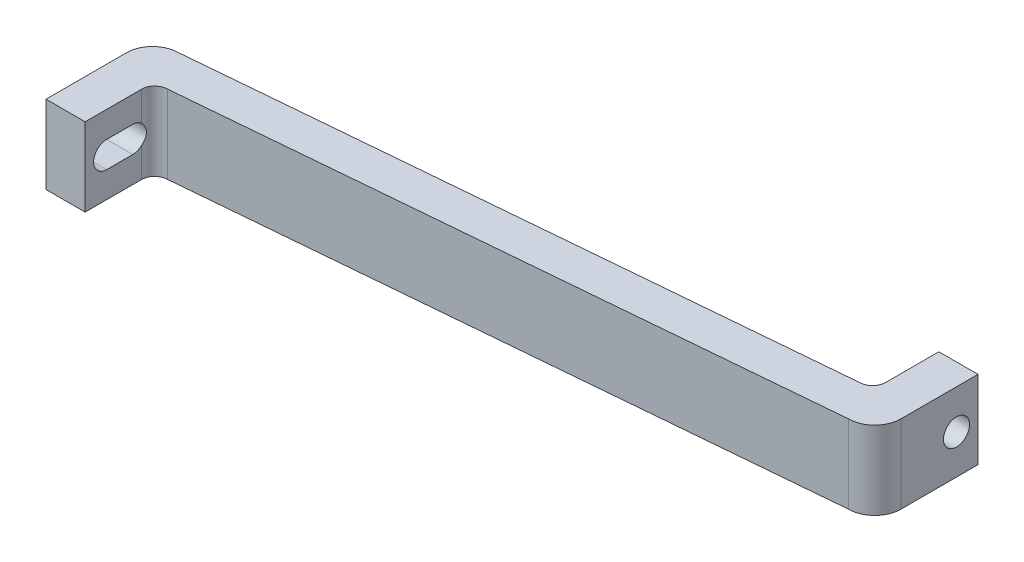
ISO-10303-21;
HEADER;
FILE_DESCRIPTION(('STEP AP214'),'2;1');
FILE_NAME('part.step','',(''),(''),'','','');
FILE_SCHEMA(('AUTOMOTIVE_DESIGN { 1 0 10303 214 1 1 1 1 }'));
ENDSEC;
DATA;
#1=APPLICATION_CONTEXT('core data for automotive mechanical design processes');
#2=APPLICATION_PROTOCOL_DEFINITION('international standard','automotive_design',2000,#1);
#3=PRODUCT_CONTEXT('',#1,'mechanical');
#4=PRODUCT('Part','Part','',(#3));
#5=PRODUCT_RELATED_PRODUCT_CATEGORY('part','',(#4));
#6=PRODUCT_DEFINITION_FORMATION('','',#4);
#7=PRODUCT_DEFINITION_CONTEXT('part definition',#1,'design');
#8=PRODUCT_DEFINITION('design','',#6,#7);
#9=PRODUCT_DEFINITION_SHAPE('','',#8);
#10=(LENGTH_UNIT() NAMED_UNIT(*) SI_UNIT(.MILLI.,.METRE.));
#11=(NAMED_UNIT(*) PLANE_ANGLE_UNIT() SI_UNIT($,.RADIAN.));
#12=(NAMED_UNIT(*) SI_UNIT($,.STERADIAN.) SOLID_ANGLE_UNIT());
#13=UNCERTAINTY_MEASURE_WITH_UNIT(LENGTH_MEASURE(1.E-05),#10,'distance_accuracy_value','');
#14=(GEOMETRIC_REPRESENTATION_CONTEXT(3) GLOBAL_UNCERTAINTY_ASSIGNED_CONTEXT((#13)) GLOBAL_UNIT_ASSIGNED_CONTEXT((#10,
#11,#12)) REPRESENTATION_CONTEXT('',''));
#15=CARTESIAN_POINT('',(0.,0.,0.));
#16=DIRECTION('',(0.,0.,1.));
#17=DIRECTION('',(1.,0.,0.));
#18=AXIS2_PLACEMENT_3D('',#15,#16,#17);
#19=CARTESIAN_POINT('',(0.,6.,0.));
#20=DIRECTION('',(1.,0.,0.));
#21=DIRECTION('',(0.,0.,-1.));
#22=AXIS2_PLACEMENT_3D('',#19,#20,#21);
#23=PLANE('',#22);
#24=DIRECTION('',(0.,0.,1.));
#25=VECTOR('',#24,1.);
#26=CARTESIAN_POINT('',(0.,0.,0.));
#27=LINE('',#26,#25);
#28=CARTESIAN_POINT('',(0.,0.,-6.17));
#29=VERTEX_POINT('',#28);
#30=CARTESIAN_POINT('',(0.,0.,0.));
#31=VERTEX_POINT('',#30);
#32=EDGE_CURVE('E272',#29,#31,#27,.T.);
#33=ORIENTED_EDGE('',*,*,#32,.T.);
#34=DIRECTION('',(0.,-1.,0.));
#35=VECTOR('',#34,1.);
#36=CARTESIAN_POINT('',(0.,6.,0.));
#37=LINE('',#36,#35);
#38=CARTESIAN_POINT('',(0.,6.,0.));
#39=VERTEX_POINT('',#38);
#40=EDGE_CURVE('E296',#39,#31,#37,.T.);
#41=ORIENTED_EDGE('',*,*,#40,.F.);
#42=DIRECTION('',(0.,0.,1.));
#43=VECTOR('',#42,1.);
#44=CARTESIAN_POINT('',(0.,6.,0.));
#45=LINE('',#44,#43);
#46=CARTESIAN_POINT('',(0.,6.,-6.17));
#47=VERTEX_POINT('',#46);
#48=EDGE_CURVE('E231',#47,#39,#45,.T.);
#49=ORIENTED_EDGE('',*,*,#48,.F.);
#50=DIRECTION('',(0.,-1.,0.));
#51=VECTOR('',#50,1.);
#52=CARTESIAN_POINT('',(0.,6.,-6.17));
#53=LINE('',#52,#51);
#54=EDGE_CURVE('E300',#47,#29,#53,.T.);
#55=ORIENTED_EDGE('',*,*,#54,.T.);
#56=EDGE_LOOP('',(#33,#41,#49,#55));
#57=FACE_BOUND('',#56,.T.);
#58=CARTESIAN_POINT('',(0.,3.,-1.65));
#59=DIRECTION('',(1.,0.,0.));
#60=DIRECTION('',(0.,0.,-1.));
#61=AXIS2_PLACEMENT_3D('',#58,#59,#60);
#62=CIRCLE('',#61,1.);
#63=CARTESIAN_POINT('',(0.,4.,-1.65));
#64=VERTEX_POINT('',#63);
#65=CARTESIAN_POINT('',(0.,2.,-1.65));
#66=VERTEX_POINT('',#65);
#67=EDGE_CURVE('E62',#64,#66,#62,.T.);
#68=ORIENTED_EDGE('',*,*,#67,.T.);
#69=DIRECTION('',(0.,0.,-1.));
#70=VECTOR('',#69,1.);
#71=CARTESIAN_POINT('',(0.,2.,-1.65));
#72=LINE('',#71,#70);
#73=CARTESIAN_POINT('',(0.,2.,-3.65));
#74=VERTEX_POINT('',#73);
#75=EDGE_CURVE('E187',#66,#74,#72,.T.);
#76=ORIENTED_EDGE('',*,*,#75,.T.);
#77=CARTESIAN_POINT('',(0.,3.,-3.65));
#78=DIRECTION('',(1.,0.,0.));
#79=DIRECTION('',(0.,0.,-1.));
#80=AXIS2_PLACEMENT_3D('',#77,#78,#79);
#81=CIRCLE('',#80,1.);
#82=CARTESIAN_POINT('',(0.,4.,-3.65));
#83=VERTEX_POINT('',#82);
#84=EDGE_CURVE('E170',#74,#83,#81,.T.);
#85=ORIENTED_EDGE('',*,*,#84,.T.);
#86=DIRECTION('',(0.,0.,1.));
#87=VECTOR('',#86,1.);
#88=CARTESIAN_POINT('',(0.,4.,-1.65));
#89=LINE('',#88,#87);
#90=EDGE_CURVE('E181',#83,#64,#89,.T.);
#91=ORIENTED_EDGE('',*,*,#90,.T.);
#92=EDGE_LOOP('',(#68,#76,#85,#91));
#93=FACE_BOUND('',#92,.T.);
#94=ADVANCED_FACE('F45',(#57,#93),#23,.F.);
#95=CARTESIAN_POINT('',(3.,6.,0.));
#96=DIRECTION('',(-1.,0.,0.));
#97=DIRECTION('',(0.,0.,1.));
#98=AXIS2_PLACEMENT_3D('',#95,#96,#97);
#99=PLANE('',#98);
#100=CARTESIAN_POINT('',(3.,3.,-3.65));
#101=DIRECTION('',(-1.,0.,0.));
#102=DIRECTION('',(0.,0.,1.));
#103=AXIS2_PLACEMENT_3D('',#100,#101,#102);
#104=CIRCLE('',#103,1.);
#105=CARTESIAN_POINT('',(3.,2.,-3.65));
#106=VERTEX_POINT('',#105);
#107=CARTESIAN_POINT('',(3.,2.26678788880707,-4.33));
#108=VERTEX_POINT('',#107);
#109=EDGE_CURVE('E70',#106,#108,#104,.F.);
#110=ORIENTED_EDGE('',*,*,#109,.F.);
#111=DIRECTION('',(0.,0.,-1.));
#112=VECTOR('',#111,1.);
#113=CARTESIAN_POINT('',(3.,2.,0.));
#114=LINE('',#113,#112);
#115=CARTESIAN_POINT('',(3.,2.,-1.65));
#116=VERTEX_POINT('',#115);
#117=EDGE_CURVE('E11',#116,#106,#114,.T.);
#118=ORIENTED_EDGE('',*,*,#117,.F.);
#119=CARTESIAN_POINT('',(3.,3.,-1.65));
#120=DIRECTION('',(-1.,0.,0.));
#121=DIRECTION('',(0.,0.,1.));
#122=AXIS2_PLACEMENT_3D('',#119,#120,#121);
#123=CIRCLE('',#122,1.);
#124=CARTESIAN_POINT('',(3.,4.,-1.65));
#125=VERTEX_POINT('',#124);
#126=EDGE_CURVE('E55',#125,#116,#123,.F.);
#127=ORIENTED_EDGE('',*,*,#126,.F.);
#128=DIRECTION('',(0.,0.,1.));
#129=VECTOR('',#128,1.);
#130=CARTESIAN_POINT('',(3.,4.,0.));
#131=LINE('',#130,#129);
#132=CARTESIAN_POINT('',(3.,4.,-3.65));
#133=VERTEX_POINT('',#132);
#134=EDGE_CURVE('E338',#133,#125,#131,.T.);
#135=ORIENTED_EDGE('',*,*,#134,.F.);
#136=CARTESIAN_POINT('',(3.,3.73321211119294,-4.33));
#137=VERTEX_POINT('',#136);
#138=EDGE_CURVE('E173',#137,#133,#104,.F.);
#139=ORIENTED_EDGE('',*,*,#138,.F.);
#140=DIRECTION('',(0.,-1.,0.));
#141=VECTOR('',#140,1.);
#142=CARTESIAN_POINT('',(3.,6.,-4.33));
#143=LINE('',#142,#141);
#144=CARTESIAN_POINT('',(3.,6.,-4.33));
#145=VERTEX_POINT('',#144);
#146=EDGE_CURVE('E288',#145,#137,#143,.T.);
#147=ORIENTED_EDGE('',*,*,#146,.F.);
#148=DIRECTION('',(0.,0.,-1.));
#149=VECTOR('',#148,1.);
#150=CARTESIAN_POINT('',(3.,6.,0.));
#151=LINE('',#150,#149);
#152=CARTESIAN_POINT('',(3.,6.,0.));
#153=VERTEX_POINT('',#152);
#154=EDGE_CURVE('E237',#153,#145,#151,.T.);
#155=ORIENTED_EDGE('',*,*,#154,.F.);
#156=DIRECTION('',(0.,-1.,0.));
#157=VECTOR('',#156,1.);
#158=CARTESIAN_POINT('',(3.,6.,0.));
#159=LINE('',#158,#157);
#160=CARTESIAN_POINT('',(3.,0.,0.));
#161=VERTEX_POINT('',#160);
#162=EDGE_CURVE('E292',#153,#161,#159,.T.);
#163=ORIENTED_EDGE('',*,*,#162,.T.);
#164=DIRECTION('',(0.,0.,-1.));
#165=VECTOR('',#164,1.);
#166=CARTESIAN_POINT('',(3.,0.,0.));
#167=LINE('',#166,#165);
#168=CARTESIAN_POINT('',(3.,0.,-4.33));
#169=VERTEX_POINT('',#168);
#170=EDGE_CURVE('E278',#161,#169,#167,.T.);
#171=ORIENTED_EDGE('',*,*,#170,.T.);
#172=EDGE_CURVE('E287',#108,#169,#143,.T.);
#173=ORIENTED_EDGE('',*,*,#172,.F.);
#174=EDGE_LOOP('',(#110,#118,#127,#135,#139,#147,#155,#163,#171,#173));
#175=FACE_BOUND('',#174,.T.);
#176=ADVANCED_FACE('F366',(#175),#99,.F.);
#177=CARTESIAN_POINT('',(4.,6.,-4.33));
#178=DIRECTION('',(0.,-1.,0.));
#179=DIRECTION('',(0.,0.,-1.));
#180=AXIS2_PLACEMENT_3D('',#177,#178,#179);
#181=CYLINDRICAL_SURFACE('',#180,1.);
#182=ORIENTED_EDGE('',*,*,#146,.T.);
#183=CARTESIAN_POINT('',(3.26678788880707,4.,-3.65));
#184=CARTESIAN_POINT('',(3.25178376454856,3.9999995600018,-3.66617737828708));
#185=CARTESIAN_POINT('',(3.2373201952967,3.99960684613958,-3.68284872467413));
#186=CARTESIAN_POINT('',(3.20953873963745,3.99789462524912,-3.71709062883816));
#187=CARTESIAN_POINT('',(3.19622155448264,3.99657455540875,-3.73466172666719));
#188=CARTESIAN_POINT('',(3.15811078578757,3.99100994952407,-3.78856402844171));
#189=CARTESIAN_POINT('',(3.13516062083566,3.98516096779698,-3.82608139622115));
#190=CARTESIAN_POINT('',(3.09467911692455,3.9682600804344,-3.9030412269704));
#191=CARTESIAN_POINT('',(3.07717090781149,3.95718645698041,-3.94249110375919));
#192=CARTESIAN_POINT('',(3.04786400906989,3.92939505847322,-4.02144428422188));
#193=CARTESIAN_POINT('',(3.03605526630723,3.91268731041056,-4.06094736966464));
#194=CARTESIAN_POINT('',(3.01819719280977,3.87471772816809,-4.13637529458406));
#195=CARTESIAN_POINT('',(3.01188213251226,3.85373535001076,-4.17237959382102));
#196=CARTESIAN_POINT('',(3.00328023765935,3.80715814302278,-4.241816443539));
#197=CARTESIAN_POINT('',(3.00099757762566,3.78155856442955,-4.27524629464528));
#198=CARTESIAN_POINT('',(2.99948319855647,3.72440002016129,-4.34084542047995));
#199=CARTESIAN_POINT('',(3.00047497620464,3.69255022303543,-4.37276485516487));
#200=CARTESIAN_POINT('',(3.00476825684486,3.6249479609544,-4.43196054765461));
#201=CARTESIAN_POINT('',(3.0080707109313,3.5891938940841,-4.45923488774832));
#202=CARTESIAN_POINT('',(3.01640923956586,3.50830458847194,-4.51275511640822));
#203=CARTESIAN_POINT('',(3.02164066512675,3.46259197634722,-4.53810091068781));
#204=CARTESIAN_POINT('',(3.03185745331535,3.36774448977744,-4.58138840093687));
#205=CARTESIAN_POINT('',(3.03684270165387,3.31860805085512,-4.59932668585707));
#206=CARTESIAN_POINT('',(3.04545351312479,3.21388146799959,-4.62848873279843));
#207=CARTESIAN_POINT('',(3.04893557957648,3.15809141683282,-4.63904802283926));
#208=CARTESIAN_POINT('',(3.05275394938631,3.04543959150949,-4.650568807351));
#209=CARTESIAN_POINT('',(3.0530918650563,2.98857838163205,-4.65153522103946));
#210=CARTESIAN_POINT('',(3.05058152477468,2.87831115260463,-4.64403205264557));
#211=CARTESIAN_POINT('',(3.04788513752207,2.82487010942416,-4.63601231561025));
#212=CARTESIAN_POINT('',(3.04036540449292,2.72009989305686,-4.61153683753795));
#213=CARTESIAN_POINT('',(3.03554093566076,2.66877185062521,-4.59507664145887));
#214=CARTESIAN_POINT('',(3.02512714399403,2.56854295160656,-4.55379121548656));
#215=CARTESIAN_POINT('',(3.01952512804795,2.51970600960119,-4.52881428812914));
#216=CARTESIAN_POINT('',(3.00957732660491,2.4266404940192,-4.47113109605599));
#217=CARTESIAN_POINT('',(3.00523209956153,2.38241397464729,-4.43842140698719));
#218=CARTESIAN_POINT('',(2.99993152630887,2.29883286109319,-4.36520471212874));
#219=CARTESIAN_POINT('',(2.99905575481038,2.25961238860003,-4.3245368845681));
#220=CARTESIAN_POINT('',(3.00335143385569,2.18874307393746,-4.23736615906667));
#221=CARTESIAN_POINT('',(3.00851061802957,2.15707903019611,-4.19087526806731));
#222=CARTESIAN_POINT('',(3.0255693822638,2.10642565266758,-4.10141796296781));
#223=CARTESIAN_POINT('',(3.03639108260889,2.08626762447306,-4.05890839736898));
#224=CARTESIAN_POINT('',(3.06465081725159,2.05263609564171,-3.97343075779005));
#225=CARTESIAN_POINT('',(3.08208769119422,2.03916142364601,-3.9304627655056));
#226=CARTESIAN_POINT('',(3.12099467571556,2.01974865214346,-3.85140413185106));
#227=CARTESIAN_POINT('',(3.14171524450544,2.01309269678036,-3.81511310208953));
#228=CARTESIAN_POINT('',(3.18780320391956,2.00390964159642,-3.74511810545286));
#229=CARTESIAN_POINT('',(3.21316454291202,2.00137720672712,-3.71141084959077));
#230=CARTESIAN_POINT('',(3.24909767380794,2.00013866123841,-3.66945366386968));
#231=CARTESIAN_POINT('',(3.25784911545044,1.99999890727192,-3.65963477501586));
#232=CARTESIAN_POINT('',(3.26678788880707,2.,-3.65));
#233=B_SPLINE_CURVE_WITH_KNOTS('',3,(#183,#184,#185,#186,#187,#188,#189,#190,#191,#192,#193,
#194,#195,#196,#197,#198,#199,#200,#201,#202,#203,#204,#205,#206,#207,#208,#209,#210,#211,#212,
#213,#214,#215,#216,#217,#218,#219,#220,#221,#222,#223,#224,#225,#226,#227,#228,#229,#230,#231,
#232),.UNSPECIFIED.,.F.,.F.,(4,2,2,2,2,2,2,2,2,2,2,2,2,2,2,2,2,2,2,2,2,2,2,2,4),(0.,
0.0661634046356082,0.132366998555311,0.264785679311134,0.397759714689861,0.530498335730469,
0.656388071064974,0.782408056895384,0.917202535916838,1.05205253017516,1.20898894194653,
1.36599754025999,1.53577117833319,1.70545775215156,1.86701491890665,2.0286574466554,
2.19334412376059,2.35810386728662,2.52662135463651,2.69479691549295,2.83874943332919,
2.98267671239465,3.10908036966758,3.23532035441075,3.27476426188391),.UNSPECIFIED.);
#234=EDGE_CURVE('E329',#137,#108,#233,.T.);
#235=ORIENTED_EDGE('',*,*,#234,.T.);
#236=ORIENTED_EDGE('',*,*,#172,.T.);
#237=CARTESIAN_POINT('',(4.,0.,-4.33));
#238=DIRECTION('',(0.,1.,0.));
#239=DIRECTION('',(0.,0.,1.));
#240=AXIS2_PLACEMENT_3D('',#237,#238,#239);
#241=CIRCLE('',#240,1.);
#242=CARTESIAN_POINT('',(4.,0.,-5.33));
#243=VERTEX_POINT('',#242);
#244=EDGE_CURVE('E208',#243,#169,#241,.T.);
#245=ORIENTED_EDGE('',*,*,#244,.F.);
#246=DIRECTION('',(0.,-1.,0.));
#247=VECTOR('',#246,1.);
#248=CARTESIAN_POINT('',(4.,6.,-5.33));
#249=LINE('',#248,#247);
#250=CARTESIAN_POINT('',(4.,6.,-5.33));
#251=VERTEX_POINT('',#250);
#252=EDGE_CURVE('E244',#251,#243,#249,.T.);
#253=ORIENTED_EDGE('',*,*,#252,.F.);
#254=CARTESIAN_POINT('',(4.,6.,-4.33));
#255=DIRECTION('',(0.,1.,0.));
#256=DIRECTION('',(0.,0.,1.));
#257=AXIS2_PLACEMENT_3D('',#254,#255,#256);
#258=CIRCLE('',#257,1.);
#259=EDGE_CURVE('E240',#251,#145,#258,.T.);
#260=ORIENTED_EDGE('',*,*,#259,.T.);
#261=EDGE_LOOP('',(#182,#235,#236,#245,#253,#260));
#262=FACE_BOUND('',#261,.T.);
#263=ADVANCED_FACE('F340',(#262),#181,.F.);
#264=CARTESIAN_POINT('',(-0.433380520967159,6.,-4.9411555834735));
#265=DIRECTION('',(-0.0873729081377682,0.,-0.996175674729889));
#266=DIRECTION('',(-0.996175674729889,0.,0.0873729081377682));
#267=AXIS2_PLACEMENT_3D('',#264,#265,#266);
#268=PLANE('',#267);
#269=DIRECTION('',(0.996175674729889,0.,-0.0873729081377682));
#270=VECTOR('',#269,1.);
#271=CARTESIAN_POINT('',(-0.433380520967159,0.,-4.9411555834735));
#272=LINE('',#271,#270);
#273=CARTESIAN_POINT('',(52.,0.,-9.54000000000004));
#274=VERTEX_POINT('',#273);
#275=EDGE_CURVE('E202',#243,#274,#272,.T.);
#276=ORIENTED_EDGE('',*,*,#275,.T.);
#277=DIRECTION('',(0.,-1.,0.));
#278=VECTOR('',#277,1.);
#279=CARTESIAN_POINT('',(52.,6.,-9.54000000000004));
#280=LINE('',#279,#278);
#281=CARTESIAN_POINT('',(52.,6.,-9.54000000000004));
#282=VERTEX_POINT('',#281);
#283=EDGE_CURVE('E325',#282,#274,#280,.T.);
#284=ORIENTED_EDGE('',*,*,#283,.F.);
#285=DIRECTION('',(0.996175674729889,0.,-0.0873729081377682));
#286=VECTOR('',#285,1.);
#287=CARTESIAN_POINT('',(-0.433380520967159,6.,-4.9411555834735));
#288=LINE('',#287,#286);
#289=EDGE_CURVE('E203',#251,#282,#288,.T.);
#290=ORIENTED_EDGE('',*,*,#289,.F.);
#291=ORIENTED_EDGE('',*,*,#252,.T.);
#292=EDGE_LOOP('',(#276,#284,#290,#291));
#293=FACE_BOUND('',#292,.T.);
#294=ADVANCED_FACE('F47',(#293),#268,.F.);
#295=CARTESIAN_POINT('',(52.,6.,-11.54));
#296=DIRECTION('',(0.,-1.,0.));
#297=DIRECTION('',(0.,0.,-1.));
#298=AXIS2_PLACEMENT_3D('',#295,#296,#297);
#299=CYLINDRICAL_SURFACE('',#298,2.);
#300=CARTESIAN_POINT('',(52.,0.,-11.54));
#301=DIRECTION('',(0.,1.,0.));
#302=DIRECTION('',(0.,0.,1.));
#303=AXIS2_PLACEMENT_3D('',#300,#301,#302);
#304=CIRCLE('',#303,2.);
#305=CARTESIAN_POINT('',(54.,0.,-11.54));
#306=VERTEX_POINT('',#305);
#307=EDGE_CURVE('E248',#274,#306,#304,.T.);
#308=ORIENTED_EDGE('',*,*,#307,.T.);
#309=DIRECTION('',(0.,-1.,0.));
#310=VECTOR('',#309,1.);
#311=CARTESIAN_POINT('',(54.,6.,-11.54));
#312=LINE('',#311,#310);
#313=CARTESIAN_POINT('',(54.,6.,-11.54));
#314=VERTEX_POINT('',#313);
#315=EDGE_CURVE('E321',#314,#306,#312,.T.);
#316=ORIENTED_EDGE('',*,*,#315,.F.);
#317=CARTESIAN_POINT('',(52.,6.,-11.54));
#318=DIRECTION('',(0.,1.,0.));
#319=DIRECTION('',(0.,0.,1.));
#320=AXIS2_PLACEMENT_3D('',#317,#318,#319);
#321=CIRCLE('',#320,2.);
#322=EDGE_CURVE('E207',#282,#314,#321,.T.);
#323=ORIENTED_EDGE('',*,*,#322,.F.);
#324=ORIENTED_EDGE('',*,*,#283,.T.);
#325=EDGE_LOOP('',(#308,#316,#323,#324));
#326=FACE_BOUND('',#325,.T.);
#327=ADVANCED_FACE('F397',(#326),#299,.T.);
#328=CARTESIAN_POINT('',(54.,6.,0.));
#329=DIRECTION('',(-1.,0.,0.));
#330=DIRECTION('',(0.,0.,1.));
#331=AXIS2_PLACEMENT_3D('',#328,#329,#330);
#332=PLANE('',#331);
#333=CARTESIAN_POINT('',(54.,3.00000000000001,-15.81));
#334=DIRECTION('',(-1.,0.,0.));
#335=DIRECTION('',(0.,0.,1.));
#336=AXIS2_PLACEMENT_3D('',#333,#334,#335);
#337=CIRCLE('',#336,1.00000000000001);
#338=CARTESIAN_POINT('',(54.,3.00000000000001,-14.81));
#339=VERTEX_POINT('',#338);
#340=EDGE_CURVE('E198',#339,#339,#337,.F.);
#341=ORIENTED_EDGE('',*,*,#340,.F.);
#342=EDGE_LOOP('',(#341));
#343=FACE_BOUND('',#342,.T.);
#344=DIRECTION('',(0.,0.,-1.));
#345=VECTOR('',#344,1.);
#346=CARTESIAN_POINT('',(54.,0.,0.));
#347=LINE('',#346,#345);
#348=CARTESIAN_POINT('',(54.,0.,-17.46));
#349=VERTEX_POINT('',#348);
#350=EDGE_CURVE('E251',#306,#349,#347,.T.);
#351=ORIENTED_EDGE('',*,*,#350,.T.);
#352=DIRECTION('',(0.,-1.,0.));
#353=VECTOR('',#352,1.);
#354=CARTESIAN_POINT('',(54.,6.,-17.46));
#355=LINE('',#354,#353);
#356=CARTESIAN_POINT('',(54.,6.,-17.46));
#357=VERTEX_POINT('',#356);
#358=EDGE_CURVE('E317',#357,#349,#355,.T.);
#359=ORIENTED_EDGE('',*,*,#358,.F.);
#360=DIRECTION('',(0.,0.,-1.));
#361=VECTOR('',#360,1.);
#362=CARTESIAN_POINT('',(54.,6.,0.));
#363=LINE('',#362,#361);
#364=EDGE_CURVE('E211',#314,#357,#363,.T.);
#365=ORIENTED_EDGE('',*,*,#364,.F.);
#366=ORIENTED_EDGE('',*,*,#315,.T.);
#367=EDGE_LOOP('',(#351,#359,#365,#366));
#368=FACE_BOUND('',#367,.T.);
#369=ADVANCED_FACE('F394',(#343,#368),#332,.F.);
#370=CARTESIAN_POINT('',(0.,6.,-17.46));
#371=DIRECTION('',(0.,0.,1.));
#372=DIRECTION('',(1.,0.,0.));
#373=AXIS2_PLACEMENT_3D('',#370,#371,#372);
#374=PLANE('',#373);
#375=DIRECTION('',(-1.,0.,0.));
#376=VECTOR('',#375,1.);
#377=CARTESIAN_POINT('',(0.,0.,-17.46));
#378=LINE('',#377,#376);
#379=CARTESIAN_POINT('',(51.,0.,-17.46));
#380=VERTEX_POINT('',#379);
#381=EDGE_CURVE('E254',#349,#380,#378,.T.);
#382=ORIENTED_EDGE('',*,*,#381,.T.);
#383=DIRECTION('',(0.,-1.,0.));
#384=VECTOR('',#383,1.);
#385=CARTESIAN_POINT('',(51.,6.,-17.46));
#386=LINE('',#385,#384);
#387=CARTESIAN_POINT('',(51.,6.,-17.46));
#388=VERTEX_POINT('',#387);
#389=EDGE_CURVE('E313',#388,#380,#386,.T.);
#390=ORIENTED_EDGE('',*,*,#389,.F.);
#391=DIRECTION('',(-1.,0.,0.));
#392=VECTOR('',#391,1.);
#393=CARTESIAN_POINT('',(0.,6.,-17.46));
#394=LINE('',#393,#392);
#395=EDGE_CURVE('E214',#357,#388,#394,.T.);
#396=ORIENTED_EDGE('',*,*,#395,.F.);
#397=ORIENTED_EDGE('',*,*,#358,.T.);
#398=EDGE_LOOP('',(#382,#390,#396,#397));
#399=FACE_BOUND('',#398,.T.);
#400=ADVANCED_FACE('F390',(#399),#374,.F.);
#401=CARTESIAN_POINT('',(51.,6.,0.));
#402=DIRECTION('',(1.,0.,0.));
#403=DIRECTION('',(0.,0.,-1.));
#404=AXIS2_PLACEMENT_3D('',#401,#402,#403);
#405=PLANE('',#404);
#406=CARTESIAN_POINT('',(51.,3.00000000000001,-15.81));
#407=DIRECTION('',(1.,0.,0.));
#408=DIRECTION('',(0.,0.,-1.));
#409=AXIS2_PLACEMENT_3D('',#406,#407,#408);
#410=CIRCLE('',#409,1.00000000000001);
#411=CARTESIAN_POINT('',(51.,3.00000000000001,-16.81));
#412=VERTEX_POINT('',#411);
#413=EDGE_CURVE('E49',#412,#412,#410,.F.);
#414=ORIENTED_EDGE('',*,*,#413,.F.);
#415=EDGE_LOOP('',(#414));
#416=FACE_BOUND('',#415,.T.);
#417=DIRECTION('',(0.,0.,1.));
#418=VECTOR('',#417,1.);
#419=CARTESIAN_POINT('',(51.,0.,0.));
#420=LINE('',#419,#418);
#421=CARTESIAN_POINT('',(51.,0.,-13.38));
#422=VERTEX_POINT('',#421);
#423=EDGE_CURVE('E257',#380,#422,#420,.T.);
#424=ORIENTED_EDGE('',*,*,#423,.T.);
#425=DIRECTION('',(0.,-1.,0.));
#426=VECTOR('',#425,1.);
#427=CARTESIAN_POINT('',(51.,6.,-13.38));
#428=LINE('',#427,#426);
#429=CARTESIAN_POINT('',(51.,6.,-13.38));
#430=VERTEX_POINT('',#429);
#431=EDGE_CURVE('E310',#430,#422,#428,.T.);
#432=ORIENTED_EDGE('',*,*,#431,.F.);
#433=DIRECTION('',(0.,0.,1.));
#434=VECTOR('',#433,1.);
#435=CARTESIAN_POINT('',(51.,6.,0.));
#436=LINE('',#435,#434);
#437=EDGE_CURVE('E217',#388,#430,#436,.T.);
#438=ORIENTED_EDGE('',*,*,#437,.F.);
#439=ORIENTED_EDGE('',*,*,#389,.T.);
#440=EDGE_LOOP('',(#424,#432,#438,#439));
#441=FACE_BOUND('',#440,.T.);
#442=ADVANCED_FACE('F386',(#416,#441),#405,.F.);
#443=CARTESIAN_POINT('',(50.,6.,-13.38));
#444=DIRECTION('',(0.,-1.,0.));
#445=DIRECTION('',(0.,0.,-1.));
#446=AXIS2_PLACEMENT_3D('',#443,#444,#445);
#447=CYLINDRICAL_SURFACE('',#446,0.999999999999999);
#448=CARTESIAN_POINT('',(50.,0.,-13.38));
#449=DIRECTION('',(0.,1.,0.));
#450=DIRECTION('',(0.,0.,1.));
#451=AXIS2_PLACEMENT_3D('',#448,#449,#450);
#452=CIRCLE('',#451,0.999999999999999);
#453=CARTESIAN_POINT('',(50.,0.,-12.38));
#454=VERTEX_POINT('',#453);
#455=EDGE_CURVE('E261',#454,#422,#452,.T.);
#456=ORIENTED_EDGE('',*,*,#455,.F.);
#457=DIRECTION('',(0.,-1.,0.));
#458=VECTOR('',#457,1.);
#459=CARTESIAN_POINT('',(50.,6.,-12.38));
#460=LINE('',#459,#458);
#461=CARTESIAN_POINT('',(50.,6.,-12.38));
#462=VERTEX_POINT('',#461);
#463=EDGE_CURVE('E307',#462,#454,#460,.T.);
#464=ORIENTED_EDGE('',*,*,#463,.F.);
#465=CARTESIAN_POINT('',(50.,6.,-13.38));
#466=DIRECTION('',(0.,1.,0.));
#467=DIRECTION('',(0.,0.,1.));
#468=AXIS2_PLACEMENT_3D('',#465,#466,#467);
#469=CIRCLE('',#468,0.999999999999999);
#470=EDGE_CURVE('E220',#462,#430,#469,.T.);
#471=ORIENTED_EDGE('',*,*,#470,.T.);
#472=ORIENTED_EDGE('',*,*,#431,.T.);
#473=EDGE_LOOP('',(#456,#464,#471,#472));
#474=FACE_BOUND('',#473,.T.);
#475=ADVANCED_FACE('F382',(#474),#447,.F.);
#476=CARTESIAN_POINT('',(-0.695838665757061,6.,-7.93355248369089));
#477=DIRECTION('',(-0.0873729081377681,0.,-0.996175674729889));
#478=DIRECTION('',(-0.996175674729889,0.,0.0873729081377681));
#479=AXIS2_PLACEMENT_3D('',#476,#477,#478);
#480=PLANE('',#479);
#481=DIRECTION('',(0.996175674729889,0.,-0.0873729081377681));
#482=VECTOR('',#481,1.);
#483=CARTESIAN_POINT('',(-0.695838665757061,0.,-7.93355248369089));
#484=LINE('',#483,#482);
#485=CARTESIAN_POINT('',(1.99999999999999,0.,-8.17));
#486=VERTEX_POINT('',#485);
#487=EDGE_CURVE('E265',#486,#454,#484,.T.);
#488=ORIENTED_EDGE('',*,*,#487,.F.);
#489=DIRECTION('',(0.,-1.,0.));
#490=VECTOR('',#489,1.);
#491=CARTESIAN_POINT('',(1.99999999999999,6.,-8.17));
#492=LINE('',#491,#490);
#493=CARTESIAN_POINT('',(1.99999999999999,6.,-8.17));
#494=VERTEX_POINT('',#493);
#495=EDGE_CURVE('E304',#494,#486,#492,.T.);
#496=ORIENTED_EDGE('',*,*,#495,.F.);
#497=DIRECTION('',(0.996175674729889,0.,-0.0873729081377681));
#498=VECTOR('',#497,1.);
#499=CARTESIAN_POINT('',(-0.695838665757061,6.,-7.93355248369089));
#500=LINE('',#499,#498);
#501=EDGE_CURVE('E224',#494,#462,#500,.T.);
#502=ORIENTED_EDGE('',*,*,#501,.T.);
#503=ORIENTED_EDGE('',*,*,#463,.T.);
#504=EDGE_LOOP('',(#488,#496,#502,#503));
#505=FACE_BOUND('',#504,.T.);
#506=ADVANCED_FACE('F378',(#505),#480,.T.);
#507=CARTESIAN_POINT('',(2.,6.,-6.17));
#508=DIRECTION('',(0.,-1.,0.));
#509=DIRECTION('',(0.,0.,-1.));
#510=AXIS2_PLACEMENT_3D('',#507,#508,#509);
#511=CYLINDRICAL_SURFACE('',#510,2.);
#512=CARTESIAN_POINT('',(2.,0.,-6.17));
#513=DIRECTION('',(0.,1.,0.));
#514=DIRECTION('',(0.,0.,1.));
#515=AXIS2_PLACEMENT_3D('',#512,#513,#514);
#516=CIRCLE('',#515,2.);
#517=EDGE_CURVE('E269',#486,#29,#516,.T.);
#518=ORIENTED_EDGE('',*,*,#517,.T.);
#519=ORIENTED_EDGE('',*,*,#54,.F.);
#520=CARTESIAN_POINT('',(2.,6.,-6.17));
#521=DIRECTION('',(0.,1.,0.));
#522=DIRECTION('',(0.,0.,1.));
#523=AXIS2_PLACEMENT_3D('',#520,#521,#522);
#524=CIRCLE('',#523,2.);
#525=EDGE_CURVE('E228',#494,#47,#524,.T.);
#526=ORIENTED_EDGE('',*,*,#525,.F.);
#527=ORIENTED_EDGE('',*,*,#495,.T.);
#528=EDGE_LOOP('',(#518,#519,#526,#527));
#529=FACE_BOUND('',#528,.T.);
#530=ADVANCED_FACE('F375',(#529),#511,.T.);
#531=CARTESIAN_POINT('',(0.,6.,0.));
#532=DIRECTION('',(0.,0.,-1.));
#533=DIRECTION('',(-1.,0.,0.));
#534=AXIS2_PLACEMENT_3D('',#531,#532,#533);
#535=PLANE('',#534);
#536=DIRECTION('',(1.,0.,0.));
#537=VECTOR('',#536,1.);
#538=CARTESIAN_POINT('',(0.,0.,0.));
#539=LINE('',#538,#537);
#540=EDGE_CURVE('E275',#31,#161,#539,.T.);
#541=ORIENTED_EDGE('',*,*,#540,.T.);
#542=ORIENTED_EDGE('',*,*,#162,.F.);
#543=DIRECTION('',(1.,0.,0.));
#544=VECTOR('',#543,1.);
#545=CARTESIAN_POINT('',(0.,6.,0.));
#546=LINE('',#545,#544);
#547=EDGE_CURVE('E234',#39,#153,#546,.T.);
#548=ORIENTED_EDGE('',*,*,#547,.F.);
#549=ORIENTED_EDGE('',*,*,#40,.T.);
#550=EDGE_LOOP('',(#541,#542,#548,#549));
#551=FACE_BOUND('',#550,.T.);
#552=ADVANCED_FACE('F356',(#551),#535,.F.);
#553=CARTESIAN_POINT('',(0.,6.,0.));
#554=DIRECTION('',(0.,1.,0.));
#555=DIRECTION('',(0.,0.,1.));
#556=AXIS2_PLACEMENT_3D('',#553,#554,#555);
#557=PLANE('',#556);
#558=ORIENTED_EDGE('',*,*,#289,.T.);
#559=ORIENTED_EDGE('',*,*,#322,.T.);
#560=ORIENTED_EDGE('',*,*,#364,.T.);
#561=ORIENTED_EDGE('',*,*,#395,.T.);
#562=ORIENTED_EDGE('',*,*,#437,.T.);
#563=ORIENTED_EDGE('',*,*,#470,.F.);
#564=ORIENTED_EDGE('',*,*,#501,.F.);
#565=ORIENTED_EDGE('',*,*,#525,.T.);
#566=ORIENTED_EDGE('',*,*,#48,.T.);
#567=ORIENTED_EDGE('',*,*,#547,.T.);
#568=ORIENTED_EDGE('',*,*,#154,.T.);
#569=ORIENTED_EDGE('',*,*,#259,.F.);
#570=EDGE_LOOP('',(#558,#559,#560,#561,#562,#563,#564,#565,#566,#567,#568,#569));
#571=FACE_BOUND('',#570,.T.);
#572=ADVANCED_FACE('F353',(#571),#557,.T.);
#573=CARTESIAN_POINT('',(0.,0.,0.));
#574=DIRECTION('',(0.,1.,0.));
#575=DIRECTION('',(0.,0.,1.));
#576=AXIS2_PLACEMENT_3D('',#573,#574,#575);
#577=PLANE('',#576);
#578=ORIENTED_EDGE('',*,*,#275,.F.);
#579=ORIENTED_EDGE('',*,*,#244,.T.);
#580=ORIENTED_EDGE('',*,*,#170,.F.);
#581=ORIENTED_EDGE('',*,*,#540,.F.);
#582=ORIENTED_EDGE('',*,*,#32,.F.);
#583=ORIENTED_EDGE('',*,*,#517,.F.);
#584=ORIENTED_EDGE('',*,*,#487,.T.);
#585=ORIENTED_EDGE('',*,*,#455,.T.);
#586=ORIENTED_EDGE('',*,*,#423,.F.);
#587=ORIENTED_EDGE('',*,*,#381,.F.);
#588=ORIENTED_EDGE('',*,*,#350,.F.);
#589=ORIENTED_EDGE('',*,*,#307,.F.);
#590=EDGE_LOOP('',(#578,#579,#580,#581,#582,#583,#584,#585,#586,#587,#588,#589));
#591=FACE_BOUND('',#590,.T.);
#592=ADVANCED_FACE('F355',(#591),#577,.F.);
#593=CARTESIAN_POINT('',(59.,3.,-1.65));
#594=DIRECTION('',(-1.,0.,0.));
#595=DIRECTION('',(0.,0.,1.));
#596=AXIS2_PLACEMENT_3D('',#593,#594,#595);
#597=CYLINDRICAL_SURFACE('',#596,1.);
#598=ORIENTED_EDGE('',*,*,#126,.T.);
#599=DIRECTION('',(-1.,0.,0.));
#600=VECTOR('',#599,1.);
#601=CARTESIAN_POINT('',(59.,2.,-1.65));
#602=LINE('',#601,#600);
#603=EDGE_CURVE('E446',#116,#66,#602,.T.);
#604=ORIENTED_EDGE('',*,*,#603,.T.);
#605=ORIENTED_EDGE('',*,*,#67,.F.);
#606=DIRECTION('',(-1.,0.,0.));
#607=VECTOR('',#606,1.);
#608=CARTESIAN_POINT('',(59.,4.,-1.65));
#609=LINE('',#608,#607);
#610=EDGE_CURVE('E177',#125,#64,#609,.T.);
#611=ORIENTED_EDGE('',*,*,#610,.F.);
#612=EDGE_LOOP('',(#598,#604,#605,#611));
#613=FACE_BOUND('',#612,.T.);
#614=ADVANCED_FACE('F359',(#613),#597,.F.);
#615=CARTESIAN_POINT('',(59.,2.,-1.65));
#616=DIRECTION('',(0.,1.,0.));
#617=DIRECTION('',(0.,0.,1.));
#618=AXIS2_PLACEMENT_3D('',#615,#616,#617);
#619=PLANE('',#618);
#620=ORIENTED_EDGE('',*,*,#117,.T.);
#621=DIRECTION('',(-1.,0.,0.));
#622=VECTOR('',#621,1.);
#623=CARTESIAN_POINT('',(59.,2.,-3.65));
#624=LINE('',#623,#622);
#625=EDGE_CURVE('E178',#106,#74,#624,.T.);
#626=ORIENTED_EDGE('',*,*,#625,.T.);
#627=ORIENTED_EDGE('',*,*,#75,.F.);
#628=ORIENTED_EDGE('',*,*,#603,.F.);
#629=EDGE_LOOP('',(#620,#626,#627,#628));
#630=FACE_BOUND('',#629,.T.);
#631=ADVANCED_FACE('F349',(#630),#619,.T.);
#632=CARTESIAN_POINT('',(59.,4.,-1.65));
#633=DIRECTION('',(0.,-1.,0.));
#634=DIRECTION('',(0.,0.,-1.));
#635=AXIS2_PLACEMENT_3D('',#632,#633,#634);
#636=PLANE('',#635);
#637=ORIENTED_EDGE('',*,*,#134,.T.);
#638=ORIENTED_EDGE('',*,*,#610,.T.);
#639=ORIENTED_EDGE('',*,*,#90,.F.);
#640=DIRECTION('',(-1.,0.,0.));
#641=VECTOR('',#640,1.);
#642=CARTESIAN_POINT('',(59.,4.,-3.65));
#643=LINE('',#642,#641);
#644=EDGE_CURVE('E166',#133,#83,#643,.T.);
#645=ORIENTED_EDGE('',*,*,#644,.F.);
#646=EDGE_LOOP('',(#637,#638,#639,#645));
#647=FACE_BOUND('',#646,.T.);
#648=ADVANCED_FACE('F182',(#647),#636,.T.);
#649=CARTESIAN_POINT('',(59.,3.,-3.65));
#650=DIRECTION('',(-1.,0.,0.));
#651=DIRECTION('',(0.,0.,1.));
#652=AXIS2_PLACEMENT_3D('',#649,#650,#651);
#653=CYLINDRICAL_SURFACE('',#652,1.);
#654=ORIENTED_EDGE('',*,*,#109,.T.);
#655=ORIENTED_EDGE('',*,*,#234,.F.);
#656=ORIENTED_EDGE('',*,*,#138,.T.);
#657=ORIENTED_EDGE('',*,*,#644,.T.);
#658=ORIENTED_EDGE('',*,*,#84,.F.);
#659=ORIENTED_EDGE('',*,*,#625,.F.);
#660=EDGE_LOOP('',(#654,#655,#656,#657,#658,#659));
#661=FACE_BOUND('',#660,.T.);
#662=ADVANCED_FACE('F168',(#661),#653,.F.);
#663=CARTESIAN_POINT('',(59.,3.00000000000001,-15.81));
#664=DIRECTION('',(-1.,0.,0.));
#665=DIRECTION('',(0.,0.,1.));
#666=AXIS2_PLACEMENT_3D('',#663,#664,#665);
#667=CYLINDRICAL_SURFACE('',#666,1.00000000000001);
#668=ORIENTED_EDGE('',*,*,#413,.T.);
#669=EDGE_LOOP('',(#668));
#670=FACE_BOUND('',#669,.T.);
#671=ORIENTED_EDGE('',*,*,#340,.T.);
#672=EDGE_LOOP('',(#671));
#673=FACE_BOUND('',#672,.T.);
#674=ADVANCED_FACE('F348',(#670,#673),#667,.F.);
#675=CLOSED_SHELL('',(#94,#176,#263,#294,#327,#369,#400,#442,#475,#506,#530,#552,#572,#592,#614,
#631,#648,#662,#674));
#676=MANIFOLD_SOLID_BREP('B2',#675);
#677=ADVANCED_BREP_SHAPE_REPRESENTATION('',(#18,#676),#14);
#678=SHAPE_DEFINITION_REPRESENTATION(#9,#677);
ENDSEC;
END-ISO-10303-21;
